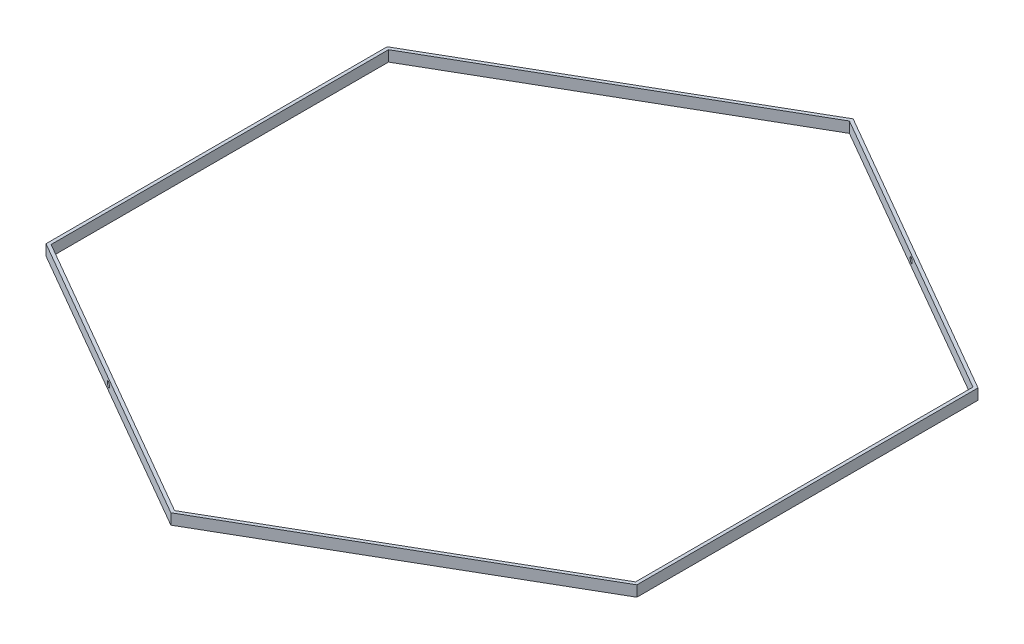
ISO-10303-21;
HEADER;
FILE_DESCRIPTION(('STEP AP214'),'2;1');
FILE_NAME('part.step','',(''),(''),'','','');
FILE_SCHEMA(('AUTOMOTIVE_DESIGN { 1 0 10303 214 1 1 1 1 }'));
ENDSEC;
DATA;
#1=APPLICATION_CONTEXT('core data for automotive mechanical design processes');
#2=APPLICATION_PROTOCOL_DEFINITION('international standard','automotive_design',2000,#1);
#3=PRODUCT_CONTEXT('',#1,'mechanical');
#4=PRODUCT('Part','Part','',(#3));
#5=PRODUCT_RELATED_PRODUCT_CATEGORY('part','',(#4));
#6=PRODUCT_DEFINITION_FORMATION('','',#4);
#7=PRODUCT_DEFINITION_CONTEXT('part definition',#1,'design');
#8=PRODUCT_DEFINITION('design','',#6,#7);
#9=PRODUCT_DEFINITION_SHAPE('','',#8);
#10=(LENGTH_UNIT() NAMED_UNIT(*) SI_UNIT(.MILLI.,.METRE.));
#11=(NAMED_UNIT(*) PLANE_ANGLE_UNIT() SI_UNIT($,.RADIAN.));
#12=(NAMED_UNIT(*) SI_UNIT($,.STERADIAN.) SOLID_ANGLE_UNIT());
#13=UNCERTAINTY_MEASURE_WITH_UNIT(LENGTH_MEASURE(1.E-05),#10,'distance_accuracy_value','');
#14=(GEOMETRIC_REPRESENTATION_CONTEXT(3) GLOBAL_UNCERTAINTY_ASSIGNED_CONTEXT((#13)) GLOBAL_UNIT_ASSIGNED_CONTEXT((#10,
#11,#12)) REPRESENTATION_CONTEXT('',''));
#15=CARTESIAN_POINT('',(0.,0.,0.));
#16=DIRECTION('',(0.,0.,1.));
#17=DIRECTION('',(1.,0.,0.));
#18=AXIS2_PLACEMENT_3D('',#15,#16,#17);
#19=CARTESIAN_POINT('',(0.,4.,0.));
#20=DIRECTION('',(0.,1.,0.));
#21=DIRECTION('',(0.,0.,1.));
#22=AXIS2_PLACEMENT_3D('',#19,#20,#21);
#23=PLANE('',#22);
#24=DIRECTION('',(-0.866025403784438,0.,-0.5));
#25=VECTOR('',#24,1.);
#26=CARTESIAN_POINT('',(110.,4.,-63.5085296108589));
#27=LINE('',#26,#25);
#28=CARTESIAN_POINT('',(110.,4.,-63.5085296108589));
#29=VERTEX_POINT('',#28);
#30=CARTESIAN_POINT('',(0.,4.,-127.017059221718));
#31=VERTEX_POINT('',#30);
#32=EDGE_CURVE('E180',#29,#31,#27,.T.);
#33=ORIENTED_EDGE('',*,*,#32,.T.);
#34=DIRECTION('',(-0.866025403784438,0.,0.5));
#35=VECTOR('',#34,1.);
#36=CARTESIAN_POINT('',(0.,4.,-127.017059221718));
#37=LINE('',#36,#35);
#38=CARTESIAN_POINT('',(-110.,4.,-63.5085296108588));
#39=VERTEX_POINT('',#38);
#40=EDGE_CURVE('E183',#31,#39,#37,.T.);
#41=ORIENTED_EDGE('',*,*,#40,.T.);
#42=DIRECTION('',(0.,0.,1.));
#43=VECTOR('',#42,1.);
#44=CARTESIAN_POINT('',(-110.,4.,-63.5085296108588));
#45=LINE('',#44,#43);
#46=CARTESIAN_POINT('',(-110.,4.,63.5085296108588));
#47=VERTEX_POINT('',#46);
#48=EDGE_CURVE('E186',#39,#47,#45,.T.);
#49=ORIENTED_EDGE('',*,*,#48,.T.);
#50=DIRECTION('',(0.866025403784439,0.,0.5));
#51=VECTOR('',#50,1.);
#52=CARTESIAN_POINT('',(-110.,4.,63.5085296108588));
#53=LINE('',#52,#51);
#54=CARTESIAN_POINT('',(0.,4.,127.017059221718));
#55=VERTEX_POINT('',#54);
#56=EDGE_CURVE('E188',#47,#55,#53,.T.);
#57=ORIENTED_EDGE('',*,*,#56,.T.);
#58=DIRECTION('',(0.866025403784438,0.,-0.5));
#59=VECTOR('',#58,1.);
#60=CARTESIAN_POINT('',(0.,4.,127.017059221718));
#61=LINE('',#60,#59);
#62=CARTESIAN_POINT('',(110.,4.,63.5085296108588));
#63=VERTEX_POINT('',#62);
#64=EDGE_CURVE('E190',#55,#63,#61,.T.);
#65=ORIENTED_EDGE('',*,*,#64,.T.);
#66=DIRECTION('',(0.,0.,-1.));
#67=VECTOR('',#66,1.);
#68=CARTESIAN_POINT('',(110.,4.,63.5085296108588));
#69=LINE('',#68,#67);
#70=EDGE_CURVE('E192',#63,#29,#69,.T.);
#71=ORIENTED_EDGE('',*,*,#70,.T.);
#72=EDGE_LOOP('',(#33,#41,#49,#57,#65,#71));
#73=FACE_BOUND('',#72,.T.);
#74=DIRECTION('',(-0.866025403784438,0.,-0.5));
#75=VECTOR('',#74,1.);
#76=CARTESIAN_POINT('',(108.8,4.,-62.8157092878313));
#77=LINE('',#76,#75);
#78=CARTESIAN_POINT('',(108.8,4.,-62.8157092878313));
#79=VERTEX_POINT('',#78);
#80=CARTESIAN_POINT('',(0.,4.,-125.631418575663));
#81=VERTEX_POINT('',#80);
#82=EDGE_CURVE('E135',#79,#81,#77,.T.);
#83=ORIENTED_EDGE('',*,*,#82,.F.);
#84=DIRECTION('',(0.,0.,-1.));
#85=VECTOR('',#84,1.);
#86=CARTESIAN_POINT('',(108.8,4.,62.8157092878313));
#87=LINE('',#86,#85);
#88=CARTESIAN_POINT('',(108.8,4.,62.8157092878313));
#89=VERTEX_POINT('',#88);
#90=EDGE_CURVE('E127',#89,#79,#87,.T.);
#91=ORIENTED_EDGE('',*,*,#90,.F.);
#92=DIRECTION('',(0.866025403784439,0.,-0.5));
#93=VECTOR('',#92,1.);
#94=CARTESIAN_POINT('',(0.,4.,125.631418575663));
#95=LINE('',#94,#93);
#96=CARTESIAN_POINT('',(0.,4.,125.631418575663));
#97=VERTEX_POINT('',#96);
#98=EDGE_CURVE('E157',#97,#89,#95,.T.);
#99=ORIENTED_EDGE('',*,*,#98,.F.);
#100=DIRECTION('',(0.866025403784439,0.,0.5));
#101=VECTOR('',#100,1.);
#102=CARTESIAN_POINT('',(-108.8,4.,62.8157092878313));
#103=LINE('',#102,#101);
#104=CARTESIAN_POINT('',(-108.8,4.,62.8157092878313));
#105=VERTEX_POINT('',#104);
#106=EDGE_CURVE('E155',#105,#97,#103,.T.);
#107=ORIENTED_EDGE('',*,*,#106,.F.);
#108=DIRECTION('',(0.,0.,1.));
#109=VECTOR('',#108,1.);
#110=CARTESIAN_POINT('',(-108.8,4.,-62.8157092878313));
#111=LINE('',#110,#109);
#112=CARTESIAN_POINT('',(-108.8,4.,-62.8157092878313));
#113=VERTEX_POINT('',#112);
#114=EDGE_CURVE('E150',#113,#105,#111,.T.);
#115=ORIENTED_EDGE('',*,*,#114,.F.);
#116=DIRECTION('',(-0.866025403784439,0.,0.5));
#117=VECTOR('',#116,1.);
#118=CARTESIAN_POINT('',(0.,4.,-125.631418575663));
#119=LINE('',#118,#117);
#120=EDGE_CURVE('E148',#81,#113,#119,.T.);
#121=ORIENTED_EDGE('',*,*,#120,.F.);
#122=EDGE_LOOP('',(#83,#91,#99,#107,#115,#121));
#123=FACE_BOUND('',#122,.T.);
#124=ADVANCED_FACE('F37',(#73,#123),#23,.T.);
#125=CARTESIAN_POINT('',(0.,0.,0.));
#126=DIRECTION('',(0.,1.,0.));
#127=DIRECTION('',(0.,0.,1.));
#128=AXIS2_PLACEMENT_3D('',#125,#126,#127);
#129=PLANE('',#128);
#130=DIRECTION('',(-0.866025403784438,0.,-0.5));
#131=VECTOR('',#130,1.);
#132=CARTESIAN_POINT('',(110.,0.,-63.5085296108589));
#133=LINE('',#132,#131);
#134=CARTESIAN_POINT('',(110.,0.,-63.5085296108589));
#135=VERTEX_POINT('',#134);
#136=CARTESIAN_POINT('',(0.,0.,-127.017059221718));
#137=VERTEX_POINT('',#136);
#138=EDGE_CURVE('E143',#135,#137,#133,.T.);
#139=ORIENTED_EDGE('',*,*,#138,.F.);
#140=DIRECTION('',(0.,0.,-1.));
#141=VECTOR('',#140,1.);
#142=CARTESIAN_POINT('',(110.,0.,63.5085296108588));
#143=LINE('',#142,#141);
#144=CARTESIAN_POINT('',(110.,0.,63.5085296108588));
#145=VERTEX_POINT('',#144);
#146=EDGE_CURVE('E184',#145,#135,#143,.T.);
#147=ORIENTED_EDGE('',*,*,#146,.F.);
#148=DIRECTION('',(0.866025403784438,0.,-0.5));
#149=VECTOR('',#148,1.);
#150=CARTESIAN_POINT('',(0.,0.,127.017059221718));
#151=LINE('',#150,#149);
#152=CARTESIAN_POINT('',(0.,0.,127.017059221718));
#153=VERTEX_POINT('',#152);
#154=EDGE_CURVE('E203',#153,#145,#151,.T.);
#155=ORIENTED_EDGE('',*,*,#154,.F.);
#156=DIRECTION('',(0.866025403784439,0.,0.5));
#157=VECTOR('',#156,1.);
#158=CARTESIAN_POINT('',(-110.,0.,63.5085296108588));
#159=LINE('',#158,#157);
#160=CARTESIAN_POINT('',(-110.,0.,63.5085296108588));
#161=VERTEX_POINT('',#160);
#162=EDGE_CURVE('E201',#161,#153,#159,.T.);
#163=ORIENTED_EDGE('',*,*,#162,.F.);
#164=DIRECTION('',(0.,0.,1.));
#165=VECTOR('',#164,1.);
#166=CARTESIAN_POINT('',(-110.,0.,-63.5085296108588));
#167=LINE('',#166,#165);
#168=CARTESIAN_POINT('',(-110.,0.,-63.5085296108588));
#169=VERTEX_POINT('',#168);
#170=EDGE_CURVE('E199',#169,#161,#167,.T.);
#171=ORIENTED_EDGE('',*,*,#170,.F.);
#172=DIRECTION('',(-0.866025403784438,0.,0.5));
#173=VECTOR('',#172,1.);
#174=CARTESIAN_POINT('',(0.,0.,-127.017059221718));
#175=LINE('',#174,#173);
#176=EDGE_CURVE('E197',#137,#169,#175,.T.);
#177=ORIENTED_EDGE('',*,*,#176,.F.);
#178=EDGE_LOOP('',(#139,#147,#155,#163,#171,#177));
#179=FACE_BOUND('',#178,.T.);
#180=DIRECTION('',(0.,0.,-1.));
#181=VECTOR('',#180,1.);
#182=CARTESIAN_POINT('',(108.8,0.,62.8157092878313));
#183=LINE('',#182,#181);
#184=CARTESIAN_POINT('',(108.8,0.,62.8157092878313));
#185=VERTEX_POINT('',#184);
#186=CARTESIAN_POINT('',(108.8,0.,-62.8157092878313));
#187=VERTEX_POINT('',#186);
#188=EDGE_CURVE('E61',#185,#187,#183,.T.);
#189=ORIENTED_EDGE('',*,*,#188,.T.);
#190=DIRECTION('',(-0.866025403784438,0.,-0.5));
#191=VECTOR('',#190,1.);
#192=CARTESIAN_POINT('',(108.8,0.,-62.8157092878313));
#193=LINE('',#192,#191);
#194=CARTESIAN_POINT('',(0.,0.,-125.631418575663));
#195=VERTEX_POINT('',#194);
#196=EDGE_CURVE('E142',#187,#195,#193,.T.);
#197=ORIENTED_EDGE('',*,*,#196,.T.);
#198=DIRECTION('',(-0.866025403784439,0.,0.5));
#199=VECTOR('',#198,1.);
#200=CARTESIAN_POINT('',(0.,0.,-125.631418575663));
#201=LINE('',#200,#199);
#202=CARTESIAN_POINT('',(-108.8,0.,-62.8157092878313));
#203=VERTEX_POINT('',#202);
#204=EDGE_CURVE('E162',#195,#203,#201,.T.);
#205=ORIENTED_EDGE('',*,*,#204,.T.);
#206=DIRECTION('',(0.,0.,1.));
#207=VECTOR('',#206,1.);
#208=CARTESIAN_POINT('',(-108.8,0.,-62.8157092878313));
#209=LINE('',#208,#207);
#210=CARTESIAN_POINT('',(-108.8,0.,62.8157092878313));
#211=VERTEX_POINT('',#210);
#212=EDGE_CURVE('E165',#203,#211,#209,.T.);
#213=ORIENTED_EDGE('',*,*,#212,.T.);
#214=DIRECTION('',(0.866025403784439,0.,0.5));
#215=VECTOR('',#214,1.);
#216=CARTESIAN_POINT('',(-108.8,0.,62.8157092878313));
#217=LINE('',#216,#215);
#218=CARTESIAN_POINT('',(0.,0.,125.631418575663));
#219=VERTEX_POINT('',#218);
#220=EDGE_CURVE('E168',#211,#219,#217,.T.);
#221=ORIENTED_EDGE('',*,*,#220,.T.);
#222=DIRECTION('',(0.866025403784439,0.,-0.5));
#223=VECTOR('',#222,1.);
#224=CARTESIAN_POINT('',(0.,0.,125.631418575663));
#225=LINE('',#224,#223);
#226=EDGE_CURVE('E136',#219,#185,#225,.T.);
#227=ORIENTED_EDGE('',*,*,#226,.T.);
#228=EDGE_LOOP('',(#189,#197,#205,#213,#221,#227));
#229=FACE_BOUND('',#228,.T.);
#230=ADVANCED_FACE('F228',(#179,#229),#129,.F.);
#231=CARTESIAN_POINT('',(110.,4.,-63.5085296108589));
#232=DIRECTION('',(-0.5,0.,0.866025403784439));
#233=DIRECTION('',(0.866025403784438,0.,0.5));
#234=AXIS2_PLACEMENT_3D('',#231,#232,#233);
#235=PLANE('',#234);
#236=CARTESIAN_POINT('',(55.,2.,-95.2627944162883));
#237=DIRECTION('',(-0.5,0.,0.866025403784439));
#238=DIRECTION('',(0.866025403784438,0.,0.5));
#239=AXIS2_PLACEMENT_3D('',#236,#237,#238);
#240=CIRCLE('',#239,0.999999999999999);
#241=CARTESIAN_POINT('',(55.8660254037845,2.,-94.7627944162883));
#242=VERTEX_POINT('',#241);
#243=EDGE_CURVE('E160',#242,#242,#240,.T.);
#244=ORIENTED_EDGE('',*,*,#243,.T.);
#245=EDGE_LOOP('',(#244));
#246=FACE_BOUND('',#245,.T.);
#247=ORIENTED_EDGE('',*,*,#138,.T.);
#248=DIRECTION('',(0.,-1.,0.));
#249=VECTOR('',#248,1.);
#250=CARTESIAN_POINT('',(0.,4.,-127.017059221718));
#251=LINE('',#250,#249);
#252=EDGE_CURVE('E11',#31,#137,#251,.T.);
#253=ORIENTED_EDGE('',*,*,#252,.F.);
#254=ORIENTED_EDGE('',*,*,#32,.F.);
#255=DIRECTION('',(0.,-1.,0.));
#256=VECTOR('',#255,1.);
#257=CARTESIAN_POINT('',(110.,4.,-63.5085296108589));
#258=LINE('',#257,#256);
#259=EDGE_CURVE('E194',#29,#135,#258,.T.);
#260=ORIENTED_EDGE('',*,*,#259,.T.);
#261=EDGE_LOOP('',(#247,#253,#254,#260));
#262=FACE_BOUND('',#261,.T.);
#263=ADVANCED_FACE('F39',(#246,#262),#235,.F.);
#264=CARTESIAN_POINT('',(0.,4.,-127.017059221718));
#265=DIRECTION('',(0.5,0.,0.866025403784439));
#266=DIRECTION('',(0.866025403784438,0.,-0.5));
#267=AXIS2_PLACEMENT_3D('',#264,#265,#266);
#268=PLANE('',#267);
#269=ORIENTED_EDGE('',*,*,#176,.T.);
#270=DIRECTION('',(0.,-1.,0.));
#271=VECTOR('',#270,1.);
#272=CARTESIAN_POINT('',(-110.,4.,-63.5085296108588));
#273=LINE('',#272,#271);
#274=EDGE_CURVE('E46',#39,#169,#273,.T.);
#275=ORIENTED_EDGE('',*,*,#274,.F.);
#276=ORIENTED_EDGE('',*,*,#40,.F.);
#277=ORIENTED_EDGE('',*,*,#252,.T.);
#278=EDGE_LOOP('',(#269,#275,#276,#277));
#279=FACE_BOUND('',#278,.T.);
#280=ADVANCED_FACE('F245',(#279),#268,.F.);
#281=CARTESIAN_POINT('',(-110.,4.,-63.5085296108588));
#282=DIRECTION('',(1.,0.,0.));
#283=DIRECTION('',(0.,0.,-1.));
#284=AXIS2_PLACEMENT_3D('',#281,#282,#283);
#285=PLANE('',#284);
#286=ORIENTED_EDGE('',*,*,#170,.T.);
#287=DIRECTION('',(0.,-1.,0.));
#288=VECTOR('',#287,1.);
#289=CARTESIAN_POINT('',(-110.,4.,63.5085296108588));
#290=LINE('',#289,#288);
#291=EDGE_CURVE('E214',#47,#161,#290,.T.);
#292=ORIENTED_EDGE('',*,*,#291,.F.);
#293=ORIENTED_EDGE('',*,*,#48,.F.);
#294=ORIENTED_EDGE('',*,*,#274,.T.);
#295=EDGE_LOOP('',(#286,#292,#293,#294));
#296=FACE_BOUND('',#295,.T.);
#297=ADVANCED_FACE('F222',(#296),#285,.F.);
#298=CARTESIAN_POINT('',(-110.,4.,63.5085296108588));
#299=DIRECTION('',(0.5,0.,-0.866025403784439));
#300=DIRECTION('',(-0.866025403784439,0.,-0.5));
#301=AXIS2_PLACEMENT_3D('',#298,#299,#300);
#302=PLANE('',#301);
#303=CARTESIAN_POINT('',(-55.,2.,95.2627944162883));
#304=DIRECTION('',(-0.5,0.,0.866025403784439));
#305=DIRECTION('',(0.866025403784439,0.,0.5));
#306=AXIS2_PLACEMENT_3D('',#303,#304,#305);
#307=CIRCLE('',#306,0.999999999999999);
#308=CARTESIAN_POINT('',(-54.1339745962156,2.,95.7627944162883));
#309=VERTEX_POINT('',#308);
#310=EDGE_CURVE('E295',#309,#309,#307,.T.);
#311=ORIENTED_EDGE('',*,*,#310,.F.);
#312=EDGE_LOOP('',(#311));
#313=FACE_BOUND('',#312,.T.);
#314=ORIENTED_EDGE('',*,*,#162,.T.);
#315=DIRECTION('',(0.,-1.,0.));
#316=VECTOR('',#315,1.);
#317=CARTESIAN_POINT('',(0.,4.,127.017059221718));
#318=LINE('',#317,#316);
#319=EDGE_CURVE('E211',#55,#153,#318,.T.);
#320=ORIENTED_EDGE('',*,*,#319,.F.);
#321=ORIENTED_EDGE('',*,*,#56,.F.);
#322=ORIENTED_EDGE('',*,*,#291,.T.);
#323=EDGE_LOOP('',(#314,#320,#321,#322));
#324=FACE_BOUND('',#323,.T.);
#325=ADVANCED_FACE('F234',(#313,#324),#302,.F.);
#326=CARTESIAN_POINT('',(0.,4.,127.017059221718));
#327=DIRECTION('',(-0.5,0.,-0.866025403784438));
#328=DIRECTION('',(-0.866025403784439,0.,0.5));
#329=AXIS2_PLACEMENT_3D('',#326,#327,#328);
#330=PLANE('',#329);
#331=ORIENTED_EDGE('',*,*,#154,.T.);
#332=DIRECTION('',(0.,-1.,0.));
#333=VECTOR('',#332,1.);
#334=CARTESIAN_POINT('',(110.,4.,63.5085296108588));
#335=LINE('',#334,#333);
#336=EDGE_CURVE('E208',#63,#145,#335,.T.);
#337=ORIENTED_EDGE('',*,*,#336,.F.);
#338=ORIENTED_EDGE('',*,*,#64,.F.);
#339=ORIENTED_EDGE('',*,*,#319,.T.);
#340=EDGE_LOOP('',(#331,#337,#338,#339));
#341=FACE_BOUND('',#340,.T.);
#342=ADVANCED_FACE('F238',(#341),#330,.F.);
#343=CARTESIAN_POINT('',(110.,4.,63.5085296108588));
#344=DIRECTION('',(-1.,0.,0.));
#345=DIRECTION('',(0.,0.,1.));
#346=AXIS2_PLACEMENT_3D('',#343,#344,#345);
#347=PLANE('',#346);
#348=ORIENTED_EDGE('',*,*,#146,.T.);
#349=ORIENTED_EDGE('',*,*,#259,.F.);
#350=ORIENTED_EDGE('',*,*,#70,.F.);
#351=ORIENTED_EDGE('',*,*,#336,.T.);
#352=EDGE_LOOP('',(#348,#349,#350,#351));
#353=FACE_BOUND('',#352,.T.);
#354=ADVANCED_FACE('F248',(#353),#347,.F.);
#355=CARTESIAN_POINT('',(108.8,4.,62.8157092878313));
#356=DIRECTION('',(-1.,0.,0.));
#357=DIRECTION('',(0.,0.,1.));
#358=AXIS2_PLACEMENT_3D('',#355,#356,#357);
#359=PLANE('',#358);
#360=ORIENTED_EDGE('',*,*,#188,.F.);
#361=DIRECTION('',(0.,-1.,0.));
#362=VECTOR('',#361,1.);
#363=CARTESIAN_POINT('',(108.8,4.,62.8157092878313));
#364=LINE('',#363,#362);
#365=EDGE_CURVE('E131',#89,#185,#364,.T.);
#366=ORIENTED_EDGE('',*,*,#365,.F.);
#367=ORIENTED_EDGE('',*,*,#90,.T.);
#368=DIRECTION('',(0.,-1.,0.));
#369=VECTOR('',#368,1.);
#370=CARTESIAN_POINT('',(108.8,4.,-62.8157092878313));
#371=LINE('',#370,#369);
#372=EDGE_CURVE('E130',#79,#187,#371,.T.);
#373=ORIENTED_EDGE('',*,*,#372,.T.);
#374=EDGE_LOOP('',(#360,#366,#367,#373));
#375=FACE_BOUND('',#374,.T.);
#376=ADVANCED_FACE('F129',(#375),#359,.T.);
#377=CARTESIAN_POINT('',(108.8,4.,-62.8157092878313));
#378=DIRECTION('',(-0.5,0.,0.866025403784439));
#379=DIRECTION('',(0.866025403784439,0.,0.5));
#380=AXIS2_PLACEMENT_3D('',#377,#378,#379);
#381=PLANE('',#380);
#382=CARTESIAN_POINT('',(54.4000000000001,2.,-94.223563931747));
#383=DIRECTION('',(-0.5,0.,0.866025403784439));
#384=DIRECTION('',(0.866025403784439,0.,0.5));
#385=AXIS2_PLACEMENT_3D('',#382,#383,#384);
#386=CIRCLE('',#385,0.999999999999999);
#387=CARTESIAN_POINT('',(55.2660254037845,2.,-93.723563931747));
#388=VERTEX_POINT('',#387);
#389=EDGE_CURVE('E298',#388,#388,#386,.T.);
#390=ORIENTED_EDGE('',*,*,#389,.F.);
#391=EDGE_LOOP('',(#390));
#392=FACE_BOUND('',#391,.T.);
#393=ORIENTED_EDGE('',*,*,#196,.F.);
#394=ORIENTED_EDGE('',*,*,#372,.F.);
#395=ORIENTED_EDGE('',*,*,#82,.T.);
#396=DIRECTION('',(0.,-1.,0.));
#397=VECTOR('',#396,1.);
#398=CARTESIAN_POINT('',(0.,4.,-125.631418575663));
#399=LINE('',#398,#397);
#400=EDGE_CURVE('E144',#81,#195,#399,.T.);
#401=ORIENTED_EDGE('',*,*,#400,.T.);
#402=EDGE_LOOP('',(#393,#394,#395,#401));
#403=FACE_BOUND('',#402,.T.);
#404=ADVANCED_FACE('F139',(#392,#403),#381,.T.);
#405=CARTESIAN_POINT('',(0.,4.,-125.631418575663));
#406=DIRECTION('',(0.5,0.,0.866025403784439));
#407=DIRECTION('',(0.866025403784439,0.,-0.5));
#408=AXIS2_PLACEMENT_3D('',#405,#406,#407);
#409=PLANE('',#408);
#410=ORIENTED_EDGE('',*,*,#204,.F.);
#411=ORIENTED_EDGE('',*,*,#400,.F.);
#412=ORIENTED_EDGE('',*,*,#120,.T.);
#413=DIRECTION('',(0.,-1.,0.));
#414=VECTOR('',#413,1.);
#415=CARTESIAN_POINT('',(-108.8,4.,-62.8157092878313));
#416=LINE('',#415,#414);
#417=EDGE_CURVE('E177',#113,#203,#416,.T.);
#418=ORIENTED_EDGE('',*,*,#417,.T.);
#419=EDGE_LOOP('',(#410,#411,#412,#418));
#420=FACE_BOUND('',#419,.T.);
#421=ADVANCED_FACE('F266',(#420),#409,.T.);
#422=CARTESIAN_POINT('',(-108.8,4.,-62.8157092878313));
#423=DIRECTION('',(1.,0.,0.));
#424=DIRECTION('',(0.,0.,-1.));
#425=AXIS2_PLACEMENT_3D('',#422,#423,#424);
#426=PLANE('',#425);
#427=ORIENTED_EDGE('',*,*,#212,.F.);
#428=ORIENTED_EDGE('',*,*,#417,.F.);
#429=ORIENTED_EDGE('',*,*,#114,.T.);
#430=DIRECTION('',(0.,-1.,0.));
#431=VECTOR('',#430,1.);
#432=CARTESIAN_POINT('',(-108.8,4.,62.8157092878313));
#433=LINE('',#432,#431);
#434=EDGE_CURVE('E175',#105,#211,#433,.T.);
#435=ORIENTED_EDGE('',*,*,#434,.T.);
#436=EDGE_LOOP('',(#427,#428,#429,#435));
#437=FACE_BOUND('',#436,.T.);
#438=ADVANCED_FACE('F270',(#437),#426,.T.);
#439=CARTESIAN_POINT('',(-108.8,4.,62.8157092878313));
#440=DIRECTION('',(0.5,0.,-0.866025403784439));
#441=DIRECTION('',(-0.866025403784439,0.,-0.5));
#442=AXIS2_PLACEMENT_3D('',#439,#440,#441);
#443=PLANE('',#442);
#444=CARTESIAN_POINT('',(-54.4,2.,94.223563931747));
#445=DIRECTION('',(0.5,0.,-0.866025403784439));
#446=DIRECTION('',(-0.866025403784439,0.,-0.5));
#447=AXIS2_PLACEMENT_3D('',#444,#445,#446);
#448=CIRCLE('',#447,0.999999999999999);
#449=CARTESIAN_POINT('',(-53.5339745962155,2.,94.723563931747));
#450=VERTEX_POINT('',#449);
#451=EDGE_CURVE('E41',#450,#450,#448,.T.);
#452=ORIENTED_EDGE('',*,*,#451,.F.);
#453=EDGE_LOOP('',(#452));
#454=FACE_BOUND('',#453,.T.);
#455=ORIENTED_EDGE('',*,*,#220,.F.);
#456=ORIENTED_EDGE('',*,*,#434,.F.);
#457=ORIENTED_EDGE('',*,*,#106,.T.);
#458=DIRECTION('',(0.,-1.,0.));
#459=VECTOR('',#458,1.);
#460=CARTESIAN_POINT('',(0.,4.,125.631418575663));
#461=LINE('',#460,#459);
#462=EDGE_CURVE('E53',#97,#219,#461,.T.);
#463=ORIENTED_EDGE('',*,*,#462,.T.);
#464=EDGE_LOOP('',(#455,#456,#457,#463));
#465=FACE_BOUND('',#464,.T.);
#466=ADVANCED_FACE('F274',(#454,#465),#443,.T.);
#467=CARTESIAN_POINT('',(0.,4.,125.631418575663));
#468=DIRECTION('',(-0.5,0.,-0.866025403784439));
#469=DIRECTION('',(-0.866025403784439,0.,0.5));
#470=AXIS2_PLACEMENT_3D('',#467,#468,#469);
#471=PLANE('',#470);
#472=ORIENTED_EDGE('',*,*,#226,.F.);
#473=ORIENTED_EDGE('',*,*,#462,.F.);
#474=ORIENTED_EDGE('',*,*,#98,.T.);
#475=ORIENTED_EDGE('',*,*,#365,.T.);
#476=EDGE_LOOP('',(#472,#473,#474,#475));
#477=FACE_BOUND('',#476,.T.);
#478=ADVANCED_FACE('F278',(#477),#471,.T.);
#479=CARTESIAN_POINT('',(82.5,2.,-142.894191624432));
#480=DIRECTION('',(-0.5,0.,0.866025403784439));
#481=DIRECTION('',(0.866025403784439,0.,0.5));
#482=AXIS2_PLACEMENT_3D('',#479,#480,#481);
#483=CYLINDRICAL_SURFACE('',#482,0.999999999999999);
#484=CARTESIAN_POINT('',(-53.5339745962155,2.,94.723563931747));
#485=CARTESIAN_POINT('',(-53.5402245962155,2.,94.7343892492943));
#486=CARTESIAN_POINT('',(-53.5464745962155,2.,94.7452145668416));
#487=CARTESIAN_POINT('',(-53.5589745962155,2.,94.7668652019362));
#488=CARTESIAN_POINT('',(-53.5652245962155,2.,94.7776905194835));
#489=CARTESIAN_POINT('',(-53.5777245962155,2.,94.7993411545781));
#490=CARTESIAN_POINT('',(-53.5839745962155,2.,94.8101664721254));
#491=CARTESIAN_POINT('',(-53.5964745962155,2.,94.83181710722));
#492=CARTESIAN_POINT('',(-53.6027245962155,2.,94.8426424247673));
#493=CARTESIAN_POINT('',(-53.6152245962155,2.,94.8642930598619));
#494=CARTESIAN_POINT('',(-53.6214745962155,2.,94.8751183774092));
#495=CARTESIAN_POINT('',(-53.6339745962155,2.,94.8967690125039));
#496=CARTESIAN_POINT('',(-53.6402245962155,2.,94.9075943300512));
#497=CARTESIAN_POINT('',(-53.6527245962155,2.,94.9292449651458));
#498=CARTESIAN_POINT('',(-53.6589745962155,2.,94.9400702826931));
#499=CARTESIAN_POINT('',(-53.6714745962155,2.,94.9617209177877));
#500=CARTESIAN_POINT('',(-53.6777245962155,2.,94.972546235335));
#501=CARTESIAN_POINT('',(-53.6902245962156,2.,94.9941968704296));
#502=CARTESIAN_POINT('',(-53.6964745962156,2.,95.0050221879769));
#503=CARTESIAN_POINT('',(-53.7089745962155,2.,95.0266728230716));
#504=CARTESIAN_POINT('',(-53.7152245962155,2.,95.0374981406188));
#505=CARTESIAN_POINT('',(-53.7277245962155,2.,95.0591487757135));
#506=CARTESIAN_POINT('',(-53.7339745962155,2.,95.0699740932608));
#507=CARTESIAN_POINT('',(-53.7464745962156,2.,95.0916247283554));
#508=CARTESIAN_POINT('',(-53.7527245962156,2.,95.1024500459027));
#509=CARTESIAN_POINT('',(-53.7652245962156,2.,95.1241006809973));
#510=CARTESIAN_POINT('',(-53.7714745962156,2.,95.1349259985446));
#511=CARTESIAN_POINT('',(-53.7839745962156,2.,95.1565766336392));
#512=CARTESIAN_POINT('',(-53.7902245962156,2.,95.1674019511865));
#513=CARTESIAN_POINT('',(-53.8027245962156,2.,95.1890525862812));
#514=CARTESIAN_POINT('',(-53.8089745962155,2.,95.1998779038284));
#515=CARTESIAN_POINT('',(-53.8214745962156,2.,95.221528538923));
#516=CARTESIAN_POINT('',(-53.8277245962156,2.,95.2323538564703));
#517=CARTESIAN_POINT('',(-53.8402245962156,2.,95.254004491565));
#518=CARTESIAN_POINT('',(-53.8464745962156,2.,95.2648298091123));
#519=CARTESIAN_POINT('',(-53.8589745962156,2.,95.2864804442069));
#520=CARTESIAN_POINT('',(-53.8652245962156,2.,95.2973057617542));
#521=CARTESIAN_POINT('',(-53.8777245962156,2.,95.3189563968488));
#522=CARTESIAN_POINT('',(-53.8839745962156,2.,95.3297817143961));
#523=CARTESIAN_POINT('',(-53.8964745962156,2.,95.3514323494907));
#524=CARTESIAN_POINT('',(-53.9027245962156,2.,95.362257667038));
#525=CARTESIAN_POINT('',(-53.9152245962156,2.,95.3839083021326));
#526=CARTESIAN_POINT('',(-53.9214745962156,2.,95.3947336196799));
#527=CARTESIAN_POINT('',(-53.9339745962156,2.,95.4163842547746));
#528=CARTESIAN_POINT('',(-53.9402245962156,2.,95.4272095723219));
#529=CARTESIAN_POINT('',(-53.9527245962156,2.,95.4488602074165));
#530=CARTESIAN_POINT('',(-53.9589745962156,2.,95.4596855249638));
#531=CARTESIAN_POINT('',(-53.9714745962156,2.,95.4813361600584));
#532=CARTESIAN_POINT('',(-53.9777245962156,2.,95.4921614776057));
#533=CARTESIAN_POINT('',(-53.9902245962156,2.,95.5138121127003));
#534=CARTESIAN_POINT('',(-53.9964745962156,2.,95.5246374302476));
#535=CARTESIAN_POINT('',(-54.0089745962156,2.,95.5462880653423));
#536=CARTESIAN_POINT('',(-54.0152245962156,2.,95.5571133828895));
#537=CARTESIAN_POINT('',(-54.0277245962156,2.,95.5787640179842));
#538=CARTESIAN_POINT('',(-54.0339745962156,2.,95.5895893355315));
#539=CARTESIAN_POINT('',(-54.0464745962156,2.,95.6112399706261));
#540=CARTESIAN_POINT('',(-54.0527245962156,2.,95.6220652881734));
#541=CARTESIAN_POINT('',(-54.0652245962156,2.,95.643715923268));
#542=CARTESIAN_POINT('',(-54.0714745962156,2.,95.6545412408153));
#543=CARTESIAN_POINT('',(-54.0839745962156,2.,95.6761918759099));
#544=CARTESIAN_POINT('',(-54.0902245962156,2.,95.6870171934572));
#545=CARTESIAN_POINT('',(-54.1027245962156,2.,95.7086678285518));
#546=CARTESIAN_POINT('',(-54.1089745962156,2.,95.7194931460991));
#547=CARTESIAN_POINT('',(-54.1214745962156,2.,95.7411437811938));
#548=CARTESIAN_POINT('',(-54.1277245962156,2.,95.751969098741));
#549=CARTESIAN_POINT('',(-54.1339745962156,2.,95.7627944162883));
#550=B_SPLINE_CURVE_WITH_KNOTS('',3,(#484,#485,#486,#487,#488,#489,#490,#491,#492,#493,#494,
#495,#496,#497,#498,#499,#500,#501,#502,#503,#504,#505,#506,#507,#508,#509,#510,#511,#512,#513,
#514,#515,#516,#517,#518,#519,#520,#521,#522,#523,#524,#525,#526,#527,#528,#529,#530,#531,#532,
#533,#534,#535,#536,#537,#538,#539,#540,#541,#542,#543,#544,#545,#546,#547,#548,#549),
.UNSPECIFIED.,.F.,.F.,(4,2,2,2,2,2,2,2,2,2,2,2,2,2,2,2,2,2,2,2,2,2,2,2,2,2,2,2,2,2,2,2,4),(0.,
0.0375000000000036,0.0749999999999694,0.112499999999997,0.149999999999963,0.18749999999999,
0.225000000000018,0.262499999999984,0.300000000000012,0.337500000000039,0.375000000000005,
0.412500000000033,0.45000000000006,0.487500000000026,0.525000000000054,0.562500000000019,
0.600000000000023,0.637500000000051,0.675000000000016,0.712500000000044,0.75000000000001,
0.787500000000038,0.825000000000065,0.862500000000031,0.900000000000059,0.937500000000086,
0.975000000000052,1.01250000000008,1.05000000000008,1.08750000000007,1.12500000000008,
1.16250000000007,1.20000000000007),.UNSPECIFIED.);
#551=EDGE_CURVE('BSEAM282',#450,#309,#550,.T.);
#552=ORIENTED_EDGE('',*,*,#451,.T.);
#553=ORIENTED_EDGE('',*,*,#310,.T.);
#554=ORIENTED_EDGE('',*,*,#551,.T.);
#555=ORIENTED_EDGE('',*,*,#551,.F.);
#556=EDGE_LOOP('',(#552,#554,#553,#555));
#557=FACE_BOUND('',#556,.T.);
#558=ADVANCED_FACE('F282',(#557),#483,.F.);
#559=ORIENTED_EDGE('',*,*,#389,.T.);
#560=EDGE_LOOP('',(#559));
#561=FACE_BOUND('',#560,.T.);
#562=ORIENTED_EDGE('',*,*,#243,.F.);
#563=EDGE_LOOP('',(#562));
#564=FACE_BOUND('',#563,.T.);
#565=ADVANCED_FACE('F284',(#561,#564),#483,.F.);
#566=CLOSED_SHELL('',(#124,#230,#263,#280,#297,#325,#342,#354,#376,#404,#421,#438,#466,#478,
#558,#565));
#567=MANIFOLD_SOLID_BREP('B2',#566);
#568=ADVANCED_BREP_SHAPE_REPRESENTATION('',(#18,#567),#14);
#569=SHAPE_DEFINITION_REPRESENTATION(#9,#568);
ENDSEC;
END-ISO-10303-21;
